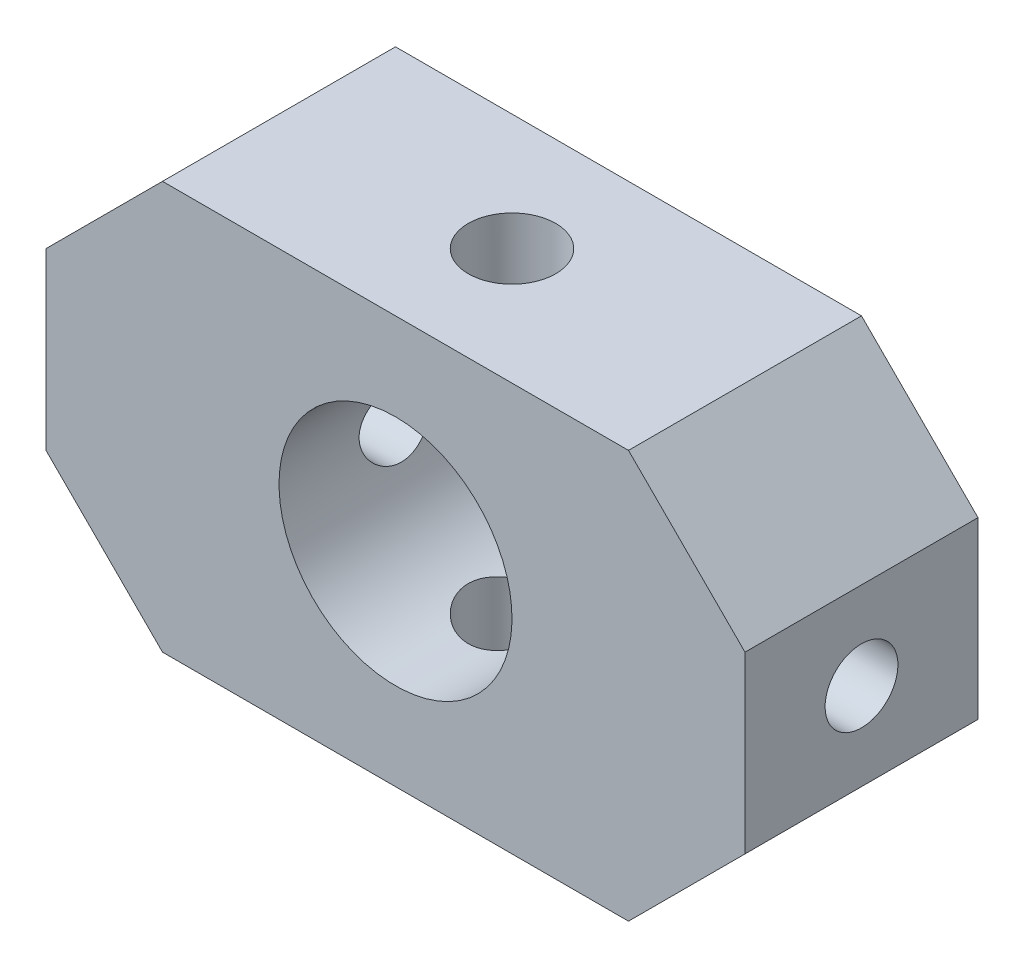
ISO-10303-21;
HEADER;
FILE_DESCRIPTION(('STEP AP214'),'2;1');
FILE_NAME('part.step','',(''),(''),'','','');
FILE_SCHEMA(('AUTOMOTIVE_DESIGN { 1 0 10303 214 1 1 1 1 }'));
ENDSEC;
DATA;
#1=APPLICATION_CONTEXT('core data for automotive mechanical design processes');
#2=APPLICATION_PROTOCOL_DEFINITION('international standard','automotive_design',2000,#1);
#3=PRODUCT_CONTEXT('',#1,'mechanical');
#4=PRODUCT('Part','Part','',(#3));
#5=PRODUCT_RELATED_PRODUCT_CATEGORY('part','',(#4));
#6=PRODUCT_DEFINITION_FORMATION('','',#4);
#7=PRODUCT_DEFINITION_CONTEXT('part definition',#1,'design');
#8=PRODUCT_DEFINITION('design','',#6,#7);
#9=PRODUCT_DEFINITION_SHAPE('','',#8);
#10=(LENGTH_UNIT() NAMED_UNIT(*) SI_UNIT(.MILLI.,.METRE.));
#11=(NAMED_UNIT(*) PLANE_ANGLE_UNIT() SI_UNIT($,.RADIAN.));
#12=(NAMED_UNIT(*) SI_UNIT($,.STERADIAN.) SOLID_ANGLE_UNIT());
#13=UNCERTAINTY_MEASURE_WITH_UNIT(LENGTH_MEASURE(1.E-05),#10,'distance_accuracy_value','');
#14=(GEOMETRIC_REPRESENTATION_CONTEXT(3) GLOBAL_UNCERTAINTY_ASSIGNED_CONTEXT((#13)) GLOBAL_UNIT_ASSIGNED_CONTEXT((#10,
#11,#12)) REPRESENTATION_CONTEXT('',''));
#15=CARTESIAN_POINT('',(0.,0.,0.));
#16=DIRECTION('',(0.,0.,1.));
#17=DIRECTION('',(1.,0.,0.));
#18=AXIS2_PLACEMENT_3D('',#15,#16,#17);
#19=CARTESIAN_POINT('',(-9.094947E-13,667.332012286217,-379.357743681072));
#20=DIRECTION('',(0.,-1.,0.));
#21=DIRECTION('',(0.,0.,-1.));
#22=AXIS2_PLACEMENT_3D('',#19,#20,#21);
#23=CYLINDRICAL_SURFACE('',#22,1.5);
#24=CARTESIAN_POINT('',(1.49999999999909,671.040111529767,-379.357743681072));
#25=CARTESIAN_POINT('',(1.49999511198471,671.040116190909,-379.276857999488));
#26=CARTESIAN_POINT('',(1.49342462043726,671.042792461082,-379.195895275863));
#27=CARTESIAN_POINT('',(1.46739553122237,671.053159451966,-379.036328094789));
#28=CARTESIAN_POINT('',(1.44791647247458,671.060858133288,-378.957727588738));
#29=CARTESIAN_POINT('',(1.39689210182157,671.080269101262,-378.805360572128));
#30=CARTESIAN_POINT('',(1.3653836631549,671.09196911147,-378.731580088393));
#31=CARTESIAN_POINT('',(1.29130569359724,671.118047885065,-378.590350076619));
#32=CARTESIAN_POINT('',(1.24873621383632,671.132426636069,-378.522900519316));
#33=CARTESIAN_POINT('',(1.15146764076575,671.163047736722,-378.392855107349));
#34=CARTESIAN_POINT('',(1.09630616188697,671.179345019224,-378.330617896596));
#35=CARTESIAN_POINT('',(0.976398614973348,671.21150910395,-378.216023018933));
#36=CARTESIAN_POINT('',(0.911650100404895,671.227375795063,-378.163667881628));
#37=CARTESIAN_POINT('',(0.771694621327232,671.257541035399,-378.0686041709));
#38=CARTESIAN_POINT('',(0.696206884644265,671.27176791097,-378.026284177692));
#39=CARTESIAN_POINT('',(0.538555706332426,671.296392373497,-377.955092479165));
#40=CARTESIAN_POINT('',(0.456394597047872,671.306791291355,-377.926216098854));
#41=CARTESIAN_POINT('',(0.291489314134773,671.322199260018,-377.883985779726));
#42=CARTESIAN_POINT('',(0.208923141283723,671.327421441928,-377.870016044248));
#43=CARTESIAN_POINT('',(0.0424643069468851,671.332652427287,-377.85602248002));
#44=CARTESIAN_POINT('',(-0.0414279133915015,671.332662929505,-377.855994107023));
#45=CARTESIAN_POINT('',(-0.203743429414592,671.327604948781,-377.869525431914));
#46=CARTESIAN_POINT('',(-0.282231952478354,671.322787719939,-377.882412937428));
#47=CARTESIAN_POINT('',(-0.435839001661055,671.308945061628,-377.920279528897));
#48=CARTESIAN_POINT('',(-0.510957279028412,671.299919322095,-377.945259505775));
#49=CARTESIAN_POINT('',(-0.656990622216135,671.278389740545,-378.006914793581));
#50=CARTESIAN_POINT('',(-0.727828484027123,671.265837130183,-378.043755231377));
#51=CARTESIAN_POINT('',(-0.862489409871084,671.238524743768,-378.127937917637));
#52=CARTESIAN_POINT('',(-0.926310509137586,671.223764352231,-378.175283096393));
#53=CARTESIAN_POINT('',(-1.04908093631065,671.192540001493,-378.282362393654));
#54=CARTESIAN_POINT('',(-1.10752840506853,671.176026894623,-378.342658375664));
#55=CARTESIAN_POINT('',(-1.21368958697655,671.143841658307,-378.472316677958));
#56=CARTESIAN_POINT('',(-1.26139735324417,671.128169998433,-378.541683987857));
#57=CARTESIAN_POINT('',(-1.34568993912095,671.099127485447,-378.689519176247));
#58=CARTESIAN_POINT('',(-1.38199556964195,671.085817415614,-378.768158838189));
#59=CARTESIAN_POINT('',(-1.44060169661454,671.063722810338,-378.930989609935));
#60=CARTESIAN_POINT('',(-1.46293219797052,671.054928586619,-379.015168394377));
#61=CARTESIAN_POINT('',(-1.48518920410886,671.046075584502,-379.143104736386));
#62=CARTESIAN_POINT('',(-1.49073488518302,671.04384815885,-379.185805581577));
#63=CARTESIAN_POINT('',(-1.49814158486117,671.040864889965,-379.271578222214));
#64=CARTESIAN_POINT('',(-1.50000260420035,671.040109046439,-379.314650017586));
#65=CARTESIAN_POINT('',(-1.49999511198653,671.040116190909,-379.438629362656));
#66=CARTESIAN_POINT('',(-1.49342462043908,671.042792461082,-379.519592086281));
#67=CARTESIAN_POINT('',(-1.46739553122419,671.053159451966,-379.679159267355));
#68=CARTESIAN_POINT('',(-1.44791647247639,671.060858133288,-379.757759773406));
#69=CARTESIAN_POINT('',(-1.3968921018234,671.080269101262,-379.910126790016));
#70=CARTESIAN_POINT('',(-1.36538366315674,671.09196911147,-379.983907273751));
#71=CARTESIAN_POINT('',(-1.29130569359908,671.118047885065,-380.125137285525));
#72=CARTESIAN_POINT('',(-1.24873621383815,671.132426636069,-380.192586842828));
#73=CARTESIAN_POINT('',(-1.15146764076757,671.163047736722,-380.322632254795));
#74=CARTESIAN_POINT('',(-1.09630616188879,671.179345019224,-380.384869465548));
#75=CARTESIAN_POINT('',(-0.97639861497517,671.21150910395,-380.499464343211));
#76=CARTESIAN_POINT('',(-0.911650100406716,671.227375795063,-380.551819480516));
#77=CARTESIAN_POINT('',(-0.771694621329053,671.257541035399,-380.646883191243));
#78=CARTESIAN_POINT('',(-0.696206884646087,671.27176791097,-380.689203184452));
#79=CARTESIAN_POINT('',(-0.538555706334249,671.296392373497,-380.760394882979));
#80=CARTESIAN_POINT('',(-0.456394597049695,671.306791291355,-380.78927126329));
#81=CARTESIAN_POINT('',(-0.291489314136593,671.322199260018,-380.831501582418));
#82=CARTESIAN_POINT('',(-0.208923141285541,671.327421441928,-380.845471317896));
#83=CARTESIAN_POINT('',(-0.0424643069486976,671.332652427287,-380.859464882124));
#84=CARTESIAN_POINT('',(0.0414279133896914,671.332662929505,-380.859493255121));
#85=CARTESIAN_POINT('',(0.203743429412783,671.327604948781,-380.84596193023));
#86=CARTESIAN_POINT('',(0.282231952476543,671.322787719939,-380.833074424716));
#87=CARTESIAN_POINT('',(0.435839001659239,671.308945061628,-380.795207833247));
#88=CARTESIAN_POINT('',(0.510957279026592,671.299919322095,-380.770227856369));
#89=CARTESIAN_POINT('',(0.6569906222143,671.278389740545,-380.708572568563));
#90=CARTESIAN_POINT('',(0.72782848402528,671.265837130183,-380.671732130767));
#91=CARTESIAN_POINT('',(0.862489409869245,671.238524743768,-380.587549444507));
#92=CARTESIAN_POINT('',(0.926310509135756,671.223764352231,-380.540204265751));
#93=CARTESIAN_POINT('',(1.04908093630883,671.192540001493,-380.43312496849));
#94=CARTESIAN_POINT('',(1.10752840506671,671.176026894623,-380.37282898648));
#95=CARTESIAN_POINT('',(1.21368958697473,671.143841658307,-380.243170684186));
#96=CARTESIAN_POINT('',(1.26139735324235,671.128169998433,-380.173803374287));
#97=CARTESIAN_POINT('',(1.34568993911913,671.099127485447,-380.025968185897));
#98=CARTESIAN_POINT('',(1.38199556964013,671.085817415614,-379.947328523955));
#99=CARTESIAN_POINT('',(1.44060169661272,671.063722810338,-379.784497752209));
#100=CARTESIAN_POINT('',(1.4629321979687,671.054928586619,-379.700318967767));
#101=CARTESIAN_POINT('',(1.48518920410704,671.046075584502,-379.572382625758));
#102=CARTESIAN_POINT('',(1.4907348851812,671.04384815885,-379.529681780567));
#103=CARTESIAN_POINT('',(1.49814158485935,671.040864889965,-379.44390913993));
#104=CARTESIAN_POINT('',(1.50000260419853,671.040109046439,-379.400837344558));
#105=CARTESIAN_POINT('',(1.49999999999909,671.040111529767,-379.357743681072));
#106=B_SPLINE_CURVE_WITH_KNOTS('',3,(#24,#25,#26,#27,#28,#29,#30,#31,#32,#33,#34,#35,#36,#37,
#38,#39,#40,#41,#42,#43,#44,#45,#46,#47,#48,#49,#50,#51,#52,#53,#54,#55,#56,#57,#58,#59,#60,#61,
#62,#63,#64,#65,#66,#67,#68,#69,#70,#71,#72,#73,#74,#75,#76,#77,#78,#79,#80,#81,#82,#83,#84,#85,
#86,#87,#88,#89,#90,#91,#92,#93,#94,#95,#96,#97,#98,#99,#100,#101,#102,#103,#104,#105),
.UNSPECIFIED.,.T.,.F.,(4,2,2,2,2,2,2,2,2,2,2,2,2,2,2,2,2,2,2,2,2,2,2,2,2,2,2,2,2,2,2,2,2,2,2,2,
2,2,2,2,4),(0.,0.24248827557271,0.485361836176238,0.72749682572558,0.969630696016833,
1.22274114851057,1.47591630441615,1.73770084383832,1.99939428001788,2.24980028562971,
2.50012467025747,2.73806440302081,2.97602166888033,3.21744659529716,3.45893895195249,
3.71452823140494,3.97025869176964,4.2318349086875,4.49284757156316,4.62203867222691,
4.75122974711301,4.99371802268572,5.23659158328925,5.47872657283858,5.72086044312984,
5.97397089562359,6.22714605152916,6.48893059095133,6.75062402713089,7.00103003274273,
7.25135441737049,7.48929415013382,7.72725141599334,7.96867634241011,8.21016869906551,
8.46575797851796,8.72148843888266,8.98306465580052,9.24407731867618,9.37326841933992,
9.50245949422603),.UNSPECIFIED.);
#107=CARTESIAN_POINT('',(1.49999999999909,671.040111529767,-379.357743681072));
#108=VERTEX_POINT('',#107);
#109=EDGE_CURVE('E145',#108,#108,#106,.T.);
#110=ORIENTED_EDGE('',*,*,#109,.T.);
#111=EDGE_LOOP('',(#110));
#112=FACE_BOUND('',#111,.T.);
#113=CARTESIAN_POINT('',(-9.094947E-13,674.332012286217,-379.357743681072));
#114=DIRECTION('',(0.,-1.,0.));
#115=DIRECTION('',(0.,0.,-1.));
#116=AXIS2_PLACEMENT_3D('',#113,#114,#115);
#117=CIRCLE('',#116,1.5);
#118=CARTESIAN_POINT('',(-9.094947E-13,674.332012286217,-380.857743681072));
#119=VERTEX_POINT('',#118);
#120=EDGE_CURVE('E151',#119,#119,#117,.F.);
#121=ORIENTED_EDGE('',*,*,#120,.T.);
#122=EDGE_LOOP('',(#121));
#123=FACE_BOUND('',#122,.T.);
#124=ADVANCED_FACE('F17',(#112,#123),#23,.F.);
#125=CARTESIAN_POINT('',(7.61974364962953,667.332012286217,-379.357743681072));
#126=DIRECTION('',(1.,0.,0.));
#127=DIRECTION('',(0.,1.,0.));
#128=AXIS2_PLACEMENT_3D('',#125,#126,#127);
#129=CYLINDRICAL_SURFACE('',#128,1.25);
#130=CARTESIAN_POINT('',(-4.00000000000091,667.332012286218,-378.107743681072));
#131=CARTESIAN_POINT('',(-3.9999979748265,667.263613918298,-378.107746590627));
#132=CARTESIAN_POINT('',(-3.99822771187706,667.195180098471,-378.113379740461));
#133=CARTESIAN_POINT('',(-3.99133282611965,667.060283057105,-378.135718037327));
#134=CARTESIAN_POINT('',(-3.98620519309232,666.993821659993,-378.152433120595));
#135=CARTESIAN_POINT('',(-3.97315753613066,666.864880025921,-378.196314909849));
#136=CARTESIAN_POINT('',(-3.96524256173569,666.802392829391,-378.223462723994));
#137=CARTESIAN_POINT('',(-3.94743820369412,666.682868363655,-378.287366638495));
#138=CARTESIAN_POINT('',(-3.93754881174486,666.625831117368,-378.324122779255));
#139=CARTESIAN_POINT('',(-3.91650317548957,666.517052485715,-378.407395409992));
#140=CARTESIAN_POINT('',(-3.90531934909937,666.465502482796,-378.454154901091));
#141=CARTESIAN_POINT('',(-3.8831026506444,666.370823329259,-378.555601754828));
#142=CARTESIAN_POINT('',(-3.87206983792989,666.327697405779,-378.61029214175));
#143=CARTESIAN_POINT('',(-3.85110630378334,666.250050223573,-378.72771506996));
#144=CARTESIAN_POINT('',(-3.84121020791978,666.215772191656,-378.790615053154));
#145=CARTESIAN_POINT('',(-3.82407115634753,666.158391777192,-378.92160841426));
#146=CARTESIAN_POINT('',(-3.81682496865236,666.135275769668,-378.989695342504));
#147=CARTESIAN_POINT('',(-3.80755627117157,666.106178919112,-379.10804053866));
#148=CARTESIAN_POINT('',(-3.80461788799766,666.097134507495,-379.157494924006));
#149=CARTESIAN_POINT('',(-3.80067444434327,666.085050314896,-379.257207705864));
#150=CARTESIAN_POINT('',(-3.79966924138223,666.082010091388,-379.307466042847));
#151=CARTESIAN_POINT('',(-3.79967347978862,666.082015268084,-379.426050233852));
#152=CARTESIAN_POINT('',(-3.80153460046542,666.087633821041,-379.494392412074));
#153=CARTESIAN_POINT('',(-3.80875232250168,666.109908856301,-379.629098719024));
#154=CARTESIAN_POINT('',(-3.81411217384587,666.126575601538,-379.695460948576));
#155=CARTESIAN_POINT('',(-3.82766004161672,666.170316227394,-379.82419218838));
#156=CARTESIAN_POINT('',(-3.83584232747325,666.197369033007,-379.886568988668));
#157=CARTESIAN_POINT('',(-3.85410554380405,666.261048653118,-380.005905316139));
#158=CARTESIAN_POINT('',(-3.86418652418366,666.297675719276,-380.062864700869));
#159=CARTESIAN_POINT('',(-3.88550022799453,666.380811970053,-380.171717020376));
#160=CARTESIAN_POINT('',(-3.89675903366385,666.427593257539,-380.223397075971));
#161=CARTESIAN_POINT('',(-3.91894030445257,666.529139935698,-380.318331274369));
#162=CARTESIAN_POINT('',(-3.92986265556981,666.58390799729,-380.361582587104));
#163=CARTESIAN_POINT('',(-3.95044050516037,666.701412913982,-380.439373253785));
#164=CARTESIAN_POINT('',(-3.96006108305101,666.764304094577,-380.473689322203));
#165=CARTESIAN_POINT('',(-3.97663209466418,666.895279613533,-380.531142613161));
#166=CARTESIAN_POINT('',(-3.9835856788351,666.963357710017,-380.554293033764));
#167=CARTESIAN_POINT('',(-3.99246724869169,667.081791129674,-380.583476148687));
#168=CARTESIAN_POINT('',(-3.99527657467944,667.131350162141,-380.592558670302));
#169=CARTESIAN_POINT('',(-3.99904363975732,667.231270513149,-380.604693324284));
#170=CARTESIAN_POINT('',(-4.00000149169302,667.281631782606,-380.607745824176));
#171=CARTESIAN_POINT('',(-3.99999797482651,667.400410654139,-380.607740771517));
#172=CARTESIAN_POINT('',(-3.99822771187709,667.468844473966,-380.602107621682));
#173=CARTESIAN_POINT('',(-3.99133282611971,667.603741515332,-380.579769324816));
#174=CARTESIAN_POINT('',(-3.98620519309241,667.670202912444,-380.563054241549));
#175=CARTESIAN_POINT('',(-3.9731575361308,667.799144546516,-380.519172452293));
#176=CARTESIAN_POINT('',(-3.96524256173585,667.861631743046,-380.492024638148));
#177=CARTESIAN_POINT('',(-3.94743820369435,667.981156208781,-380.428120723648));
#178=CARTESIAN_POINT('',(-3.93754881174512,668.038193455068,-380.391364582887));
#179=CARTESIAN_POINT('',(-3.91650317548991,668.146972086721,-380.308091952151));
#180=CARTESIAN_POINT('',(-3.90531934909976,668.19852208964,-380.261332461052));
#181=CARTESIAN_POINT('',(-3.88310265064489,668.293201243177,-380.159885607313));
#182=CARTESIAN_POINT('',(-3.87206983793042,668.336327166657,-380.105195220392));
#183=CARTESIAN_POINT('',(-3.85110630378399,668.413974348862,-379.987772292182));
#184=CARTESIAN_POINT('',(-3.8412102079205,668.44825238078,-379.924872308987));
#185=CARTESIAN_POINT('',(-3.82407115634838,668.505632795243,-379.793878947881));
#186=CARTESIAN_POINT('',(-3.81682496865328,668.528748802767,-379.725792019637));
#187=CARTESIAN_POINT('',(-3.80755627117264,668.557845653323,-379.607446823482));
#188=CARTESIAN_POINT('',(-3.80461788799879,668.566890064939,-379.557992438136));
#189=CARTESIAN_POINT('',(-3.80067444434449,668.578974257539,-379.458279656279));
#190=CARTESIAN_POINT('',(-3.79966924138347,668.582014481047,-379.408021319297));
#191=CARTESIAN_POINT('',(-3.79967347978985,668.58200930435,-379.289437128292));
#192=CARTESIAN_POINT('',(-3.80153460046665,668.576390751393,-379.22109495007));
#193=CARTESIAN_POINT('',(-3.80875232250289,668.554115716133,-379.08638864312));
#194=CARTESIAN_POINT('',(-3.81411217384707,668.537448970896,-379.020026413568));
#195=CARTESIAN_POINT('',(-3.82766004161788,668.49370834504,-378.891295173764));
#196=CARTESIAN_POINT('',(-3.83584232747438,668.466655539427,-378.828918373475));
#197=CARTESIAN_POINT('',(-3.85410554380511,668.402975919316,-378.709582046005));
#198=CARTESIAN_POINT('',(-3.86418652418469,668.366348853158,-378.652622661275));
#199=CARTESIAN_POINT('',(-3.88550022799548,668.283212602381,-378.543770341768));
#200=CARTESIAN_POINT('',(-3.89675903366474,668.236431314896,-378.492090286173));
#201=CARTESIAN_POINT('',(-3.91894030445336,668.134884636736,-378.397156087774));
#202=CARTESIAN_POINT('',(-3.92986265557055,668.080116575145,-378.35390477504));
#203=CARTESIAN_POINT('',(-3.950440505161,667.962611658452,-378.276114108359));
#204=CARTESIAN_POINT('',(-3.96006108305158,667.899720477857,-378.241798039941));
#205=CARTESIAN_POINT('',(-3.97663209466461,667.768744958901,-378.184344748983));
#206=CARTESIAN_POINT('',(-3.98358567883547,667.700666862417,-378.16119432838));
#207=CARTESIAN_POINT('',(-3.9924672486919,667.58223344276,-378.132011213457));
#208=CARTESIAN_POINT('',(-3.99527657467958,667.532674410294,-378.122928691842));
#209=CARTESIAN_POINT('',(-3.99904363975736,667.432754059287,-378.11079403786));
#210=CARTESIAN_POINT('',(-4.00000149169303,667.382392789831,-378.107741537968));
#211=CARTESIAN_POINT('',(-4.00000000000091,667.332012286218,-378.107743681072));
#212=B_SPLINE_CURVE_WITH_KNOTS('',3,(#130,#131,#132,#133,#134,#135,#136,#137,#138,#139,#140,
#141,#142,#143,#144,#145,#146,#147,#148,#149,#150,#151,#152,#153,#154,#155,#156,#157,#158,#159,
#160,#161,#162,#163,#164,#165,#166,#167,#168,#169,#170,#171,#172,#173,#174,#175,#176,#177,#178,
#179,#180,#181,#182,#183,#184,#185,#186,#187,#188,#189,#190,#191,#192,#193,#194,#195,#196,#197,
#198,#199,#200,#201,#202,#203,#204,#205,#206,#207,#208,#209,#210,#211),.UNSPECIFIED.,.T.,.F.,(4,
2,2,2,2,2,2,2,2,2,2,2,2,2,2,2,2,2,2,2,2,2,2,2,2,2,2,2,2,2,2,2,2,2,2,2,2,2,2,2,4),(0.,
0.20500663316506,0.410197327523862,0.615018195217445,0.819839924225944,1.03035755615529,
1.24095567673723,1.45684137371024,1.67246287840654,1.8231677375757,1.97386148896801,
2.17859208186309,2.38351312095856,2.58802052110897,2.79253329728788,3.00341166738081,
3.21436072131924,3.43016220536972,3.64570797794709,3.79671987044711,3.94772255862604,
4.15272919179114,4.35791988614983,4.56274075384335,4.76756248285183,4.97808011478117,
5.18867823536314,5.40456393233625,5.62018543703246,5.77089029620009,5.92158404759095,
6.12631464048609,6.33123567958167,6.53574307973201,6.74025585591106,6.95113422600388,
7.16208327994233,7.37788476399275,7.59343053657023,7.74444242906854,7.89544511724605),.UNSPECIFIED.);
#213=CARTESIAN_POINT('',(-4.00000000000091,667.332012286218,-378.107743681072));
#214=VERTEX_POINT('',#213);
#215=EDGE_CURVE('E139',#214,#214,#212,.T.);
#216=ORIENTED_EDGE('',*,*,#215,.T.);
#217=EDGE_LOOP('',(#216));
#218=FACE_BOUND('',#217,.T.);
#219=CARTESIAN_POINT('',(-12.0000000000009,667.332012286217,-379.357743681072));
#220=DIRECTION('',(1.,0.,0.));
#221=DIRECTION('',(0.,1.,0.));
#222=AXIS2_PLACEMENT_3D('',#219,#220,#221);
#223=CIRCLE('',#222,1.25);
#224=CARTESIAN_POINT('',(-12.0000000000009,668.582012286217,-379.357743681072));
#225=VERTEX_POINT('',#224);
#226=EDGE_CURVE('E21',#225,#225,#223,.F.);
#227=ORIENTED_EDGE('',*,*,#226,.T.);
#228=EDGE_LOOP('',(#227));
#229=FACE_BOUND('',#228,.T.);
#230=ADVANCED_FACE('F247',(#218,#229),#129,.F.);
#231=CARTESIAN_POINT('',(-12.0000000000009,674.332012286217,-383.357743681072));
#232=DIRECTION('',(0.,0.,1.));
#233=DIRECTION('',(1.,0.,0.));
#234=AXIS2_PLACEMENT_3D('',#231,#232,#233);
#235=PLANE('',#234);
#236=CARTESIAN_POINT('',(-9.094947E-13,667.332012286219,-383.357743681072));
#237=DIRECTION('',(0.,0.,-1.));
#238=DIRECTION('',(0.,1.,0.));
#239=AXIS2_PLACEMENT_3D('',#236,#237,#238);
#240=CIRCLE('',#239,4.);
#241=CARTESIAN_POINT('',(-9.094947E-13,671.332012286219,-383.357743681072));
#242=VERTEX_POINT('',#241);
#243=EDGE_CURVE('E273',#242,#242,#240,.F.);
#244=ORIENTED_EDGE('',*,*,#243,.T.);
#245=EDGE_LOOP('',(#244));
#246=FACE_BOUND('',#245,.T.);
#247=DIRECTION('',(1.,0.,0.));
#248=VECTOR('',#247,1.);
#249=CARTESIAN_POINT('',(-8.00000000000091,674.332012286217,-383.357743681072));
#250=LINE('',#249,#248);
#251=CARTESIAN_POINT('',(-8.00000000000091,674.332012286217,-383.357743681072));
#252=VERTEX_POINT('',#251);
#253=CARTESIAN_POINT('',(7.99999999999909,674.332012286217,-383.357743681072));
#254=VERTEX_POINT('',#253);
#255=EDGE_CURVE('E197',#252,#254,#250,.T.);
#256=ORIENTED_EDGE('',*,*,#255,.T.);
#257=DIRECTION('',(-0.707106781186547,0.707106781186548,0.));
#258=VECTOR('',#257,1.);
#259=CARTESIAN_POINT('',(9.99999999999909,672.332012286217,-383.357743681072));
#260=LINE('',#259,#258);
#261=CARTESIAN_POINT('',(11.9999999999991,670.332012286217,-383.357743681072));
#262=VERTEX_POINT('',#261);
#263=EDGE_CURVE('E156',#262,#254,#260,.T.);
#264=ORIENTED_EDGE('',*,*,#263,.F.);
#265=DIRECTION('',(0.,-1.,0.));
#266=VECTOR('',#265,1.);
#267=CARTESIAN_POINT('',(11.9999999999991,664.332012286217,-383.357743681072));
#268=LINE('',#267,#266);
#269=CARTESIAN_POINT('',(11.9999999999991,664.332012286217,-383.357743681072));
#270=VERTEX_POINT('',#269);
#271=EDGE_CURVE('E204',#262,#270,#268,.T.);
#272=ORIENTED_EDGE('',*,*,#271,.T.);
#273=DIRECTION('',(0.707106781186548,0.707106781186547,0.));
#274=VECTOR('',#273,1.);
#275=CARTESIAN_POINT('',(9.99999999999909,662.332012286217,-383.357743681072));
#276=LINE('',#275,#274);
#277=CARTESIAN_POINT('',(7.99999999999909,660.332012286217,-383.357743681072));
#278=VERTEX_POINT('',#277);
#279=EDGE_CURVE('E165',#278,#270,#276,.T.);
#280=ORIENTED_EDGE('',*,*,#279,.F.);
#281=DIRECTION('',(1.,0.,0.));
#282=VECTOR('',#281,1.);
#283=CARTESIAN_POINT('',(-8.00000000000091,660.332012286217,-383.357743681072));
#284=LINE('',#283,#282);
#285=CARTESIAN_POINT('',(-8.00000000000091,660.332012286217,-383.357743681072));
#286=VERTEX_POINT('',#285);
#287=EDGE_CURVE('E167',#278,#286,#284,.F.);
#288=ORIENTED_EDGE('',*,*,#287,.T.);
#289=DIRECTION('',(0.707106781186547,-0.707106781186548,0.));
#290=VECTOR('',#289,1.);
#291=CARTESIAN_POINT('',(-10.0000000000009,662.332012286217,-383.357743681072));
#292=LINE('',#291,#290);
#293=CARTESIAN_POINT('',(-12.0000000000009,664.332012286217,-383.357743681072));
#294=VERTEX_POINT('',#293);
#295=EDGE_CURVE('E81',#294,#286,#292,.T.);
#296=ORIENTED_EDGE('',*,*,#295,.F.);
#297=DIRECTION('',(0.,1.,0.));
#298=VECTOR('',#297,1.);
#299=CARTESIAN_POINT('',(-12.0000000000009,664.332012286217,-383.357743681072));
#300=LINE('',#299,#298);
#301=CARTESIAN_POINT('',(-12.0000000000009,670.332012286217,-383.357743681072));
#302=VERTEX_POINT('',#301);
#303=EDGE_CURVE('E83',#294,#302,#300,.T.);
#304=ORIENTED_EDGE('',*,*,#303,.T.);
#305=DIRECTION('',(-0.707106781186548,-0.707106781186547,0.));
#306=VECTOR('',#305,1.);
#307=CARTESIAN_POINT('',(-10.0000000000009,672.332012286217,-383.357743681072));
#308=LINE('',#307,#306);
#309=EDGE_CURVE('E86',#252,#302,#308,.T.);
#310=ORIENTED_EDGE('',*,*,#309,.F.);
#311=EDGE_LOOP('',(#256,#264,#272,#280,#288,#296,#304,#310));
#312=FACE_BOUND('',#311,.T.);
#313=ADVANCED_FACE('F85',(#246,#312),#235,.F.);
#314=CARTESIAN_POINT('',(7.61974364962953,667.332012286217,-379.357743681072));
#315=DIRECTION('',(1.,0.,0.));
#316=DIRECTION('',(0.,1.,0.));
#317=AXIS2_PLACEMENT_3D('',#314,#315,#316);
#318=CYLINDRICAL_SURFACE('',#317,1.25);
#319=CARTESIAN_POINT('',(3.99999999999909,667.332012286219,-380.607743681072));
#320=CARTESIAN_POINT('',(3.9999979748247,667.263613918299,-380.607740771517));
#321=CARTESIAN_POINT('',(3.99822771187528,667.195180098472,-380.602107621683));
#322=CARTESIAN_POINT('',(3.99133282611789,667.060283057105,-380.579769324817));
#323=CARTESIAN_POINT('',(3.98620519309058,666.993821659994,-380.56305424155));
#324=CARTESIAN_POINT('',(3.97315753612894,666.864880025922,-380.519172452295));
#325=CARTESIAN_POINT('',(3.96524256173397,666.802392829392,-380.49202463815));
#326=CARTESIAN_POINT('',(3.94743820369241,666.682868363656,-380.428120723649));
#327=CARTESIAN_POINT('',(3.93754881174316,666.625831117369,-380.391364582889));
#328=CARTESIAN_POINT('',(3.91650317548788,666.517052485716,-380.308091952153));
#329=CARTESIAN_POINT('',(3.9053193490977,666.465502482796,-380.261332461054));
#330=CARTESIAN_POINT('',(3.88310265064273,666.370823329259,-380.159885607316));
#331=CARTESIAN_POINT('',(3.87206983792822,666.32769740578,-380.105195220395));
#332=CARTESIAN_POINT('',(3.85110630378166,666.250050223574,-379.987772292185));
#333=CARTESIAN_POINT('',(3.84121020791809,666.215772191656,-379.924872308991));
#334=CARTESIAN_POINT('',(3.82407115634581,666.158391777192,-379.793878947885));
#335=CARTESIAN_POINT('',(3.81682496865063,666.135275769669,-379.725792019641));
#336=CARTESIAN_POINT('',(3.8075562711698,666.106178919112,-379.607446823485));
#337=CARTESIAN_POINT('',(3.80461788799587,666.097134507495,-379.557992438139));
#338=CARTESIAN_POINT('',(3.80067444434145,666.085050314896,-379.45827965628));
#339=CARTESIAN_POINT('',(3.79966924138041,666.082010091388,-379.408021319297));
#340=CARTESIAN_POINT('',(3.7996734797868,666.082015268084,-379.289437128292));
#341=CARTESIAN_POINT('',(3.8015346004636,666.087633821041,-379.22109495007));
#342=CARTESIAN_POINT('',(3.80875232249986,666.109908856301,-379.08638864312));
#343=CARTESIAN_POINT('',(3.81411217384405,666.126575601538,-379.020026413568));
#344=CARTESIAN_POINT('',(3.82766004161491,666.170316227394,-378.891295173764));
#345=CARTESIAN_POINT('',(3.83584232747143,666.197369033007,-378.828918373475));
#346=CARTESIAN_POINT('',(3.85410554380223,666.261048653118,-378.709582046005));
#347=CARTESIAN_POINT('',(3.86418652418184,666.297675719276,-378.652622661275));
#348=CARTESIAN_POINT('',(3.8855002279927,666.380811970053,-378.543770341768));
#349=CARTESIAN_POINT('',(3.89675903366202,666.427593257538,-378.492090286173));
#350=CARTESIAN_POINT('',(3.91894030445074,666.529139935698,-378.397156087775));
#351=CARTESIAN_POINT('',(3.92986265556799,666.583907997289,-378.35390477504));
#352=CARTESIAN_POINT('',(3.95044050515855,666.701412913982,-378.276114108359));
#353=CARTESIAN_POINT('',(3.96006108304918,666.764304094577,-378.241798039941));
#354=CARTESIAN_POINT('',(3.97663209466235,666.895279613533,-378.184344748983));
#355=CARTESIAN_POINT('',(3.98358567883328,666.963357710017,-378.16119432838));
#356=CARTESIAN_POINT('',(3.99246724868985,667.081791129674,-378.132011213457));
#357=CARTESIAN_POINT('',(3.9952765746776,667.131350162141,-378.122928691842));
#358=CARTESIAN_POINT('',(3.99904363975548,667.231270513148,-378.11079403786));
#359=CARTESIAN_POINT('',(4.00000149169119,667.281631782605,-378.107741537968));
#360=CARTESIAN_POINT('',(3.99999797482471,667.400410654138,-378.107746590627));
#361=CARTESIAN_POINT('',(3.99822771187531,667.468844473965,-378.113379740461));
#362=CARTESIAN_POINT('',(3.99133282611796,667.603741515331,-378.135718037328));
#363=CARTESIAN_POINT('',(3.98620519309067,667.670202912443,-378.152433120595));
#364=CARTESIAN_POINT('',(3.97315753612908,667.799144546515,-378.19631490985));
#365=CARTESIAN_POINT('',(3.96524256173414,667.861631743045,-378.223462723995));
#366=CARTESIAN_POINT('',(3.94743820369265,667.981156208781,-378.287366638496));
#367=CARTESIAN_POINT('',(3.93754881174342,668.038193455068,-378.324122779256));
#368=CARTESIAN_POINT('',(3.91650317548822,668.146972086721,-378.407395409993));
#369=CARTESIAN_POINT('',(3.90531934909807,668.19852208964,-378.454154901092));
#370=CARTESIAN_POINT('',(3.8831026506432,668.293201243177,-378.55560175483));
#371=CARTESIAN_POINT('',(3.87206983792875,668.336327166656,-378.610292141751));
#372=CARTESIAN_POINT('',(3.85110630378231,668.413974348862,-378.727715069961));
#373=CARTESIAN_POINT('',(3.84121020791881,668.448252380779,-378.790615053156));
#374=CARTESIAN_POINT('',(3.82407115634667,668.505632795243,-378.921608414262));
#375=CARTESIAN_POINT('',(3.81682496865155,668.528748802767,-378.989695342506));
#376=CARTESIAN_POINT('',(3.80755627117087,668.557845653323,-379.108040538661));
#377=CARTESIAN_POINT('',(3.804617887997,668.566890064939,-379.157494924007));
#378=CARTESIAN_POINT('',(3.80067444434267,668.578974257539,-379.257207705865));
#379=CARTESIAN_POINT('',(3.79966924138165,668.582014481047,-379.307466042847));
#380=CARTESIAN_POINT('',(3.79967347978804,668.58200930435,-379.426050233852));
#381=CARTESIAN_POINT('',(3.80153460046483,668.576390751393,-379.494392412074));
#382=CARTESIAN_POINT('',(3.80875232250107,668.554115716133,-379.629098719024));
#383=CARTESIAN_POINT('',(3.81411217384525,668.537448970896,-379.695460948576));
#384=CARTESIAN_POINT('',(3.82766004161606,668.49370834504,-379.82419218838));
#385=CARTESIAN_POINT('',(3.83584232747256,668.466655539427,-379.886568988669));
#386=CARTESIAN_POINT('',(3.8541055438033,668.402975919316,-380.005905316139));
#387=CARTESIAN_POINT('',(3.86418652418288,668.366348853158,-380.062864700869));
#388=CARTESIAN_POINT('',(3.88550022799366,668.283212602381,-380.171717020376));
#389=CARTESIAN_POINT('',(3.89675903366293,668.236431314896,-380.223397075971));
#390=CARTESIAN_POINT('',(3.91894030445155,668.134884636736,-380.31833127437));
#391=CARTESIAN_POINT('',(3.92986265556874,668.080116575145,-380.361582587104));
#392=CARTESIAN_POINT('',(3.95044050515918,667.962611658452,-380.439373253785));
#393=CARTESIAN_POINT('',(3.96006108304976,667.899720477857,-380.473689322203));
#394=CARTESIAN_POINT('',(3.97663209466279,667.768744958901,-380.531142613161));
#395=CARTESIAN_POINT('',(3.98358567883365,667.700666862417,-380.554293033764));
#396=CARTESIAN_POINT('',(3.99246724869007,667.58223344276,-380.583476148687));
#397=CARTESIAN_POINT('',(3.99527657467774,667.532674410294,-380.592558670302));
#398=CARTESIAN_POINT('',(3.99904363975552,667.432754059288,-380.604693324284));
#399=CARTESIAN_POINT('',(4.0000014916912,667.382392789832,-380.607745824176));
#400=CARTESIAN_POINT('',(3.99999999999909,667.332012286219,-380.607743681072));
#401=B_SPLINE_CURVE_WITH_KNOTS('',3,(#319,#320,#321,#322,#323,#324,#325,#326,#327,#328,#329,
#330,#331,#332,#333,#334,#335,#336,#337,#338,#339,#340,#341,#342,#343,#344,#345,#346,#347,#348,
#349,#350,#351,#352,#353,#354,#355,#356,#357,#358,#359,#360,#361,#362,#363,#364,#365,#366,#367,
#368,#369,#370,#371,#372,#373,#374,#375,#376,#377,#378,#379,#380,#381,#382,#383,#384,#385,#386,
#387,#388,#389,#390,#391,#392,#393,#394,#395,#396,#397,#398,#399,#400),.UNSPECIFIED.,.T.,.F.,(4,
2,2,2,2,2,2,2,2,2,2,2,2,2,2,2,2,2,2,2,2,2,2,2,2,2,2,2,2,2,2,2,2,2,2,2,2,2,2,2,4),(0.,
0.205006633165262,0.410197327523926,0.615018195217689,0.819839924226094,1.03035755615544,
1.24095567673722,1.45684137371038,1.67246287840658,1.82316773757622,1.97386148896898,
2.178592081864,2.38351312095953,2.58802052110998,2.79253329728885,3.00341166738166,
3.21436072132013,3.43016220537061,3.6457079779481,3.79671987044744,3.94772255862593,
4.15272919179112,4.35791988614989,4.56274075384347,4.76756248285201,4.97808011478147,
5.18867823536316,5.40456393233623,5.62018543703251,5.77089029620073,5.92158404759204,
6.12631464048712,6.3312356795827,6.53574307973309,6.7402558559121,6.95113422600496,
7.16208327994337,7.37788476399379,7.59343053657127,7.74444242906903,7.89544511724609),.UNSPECIFIED.);
#402=CARTESIAN_POINT('',(3.99999999999909,667.332012286219,-380.607743681072));
#403=VERTEX_POINT('',#402);
#404=EDGE_CURVE('E118',#403,#403,#401,.T.);
#405=ORIENTED_EDGE('',*,*,#404,.T.);
#406=EDGE_LOOP('',(#405));
#407=FACE_BOUND('',#406,.T.);
#408=CARTESIAN_POINT('',(11.9999999999991,667.332012286217,-379.357743681072));
#409=DIRECTION('',(1.,0.,0.));
#410=DIRECTION('',(0.,1.,0.));
#411=AXIS2_PLACEMENT_3D('',#408,#409,#410);
#412=CIRCLE('',#411,1.25);
#413=CARTESIAN_POINT('',(11.9999999999991,668.582012286217,-379.357743681072));
#414=VERTEX_POINT('',#413);
#415=EDGE_CURVE('E154',#414,#414,#412,.T.);
#416=ORIENTED_EDGE('',*,*,#415,.T.);
#417=EDGE_LOOP('',(#416));
#418=FACE_BOUND('',#417,.T.);
#419=ADVANCED_FACE('F256',(#407,#418),#318,.F.);
#420=CARTESIAN_POINT('',(-9.094947E-13,667.332012286217,-379.357743681072));
#421=DIRECTION('',(0.,-1.,0.));
#422=DIRECTION('',(0.,0.,-1.));
#423=AXIS2_PLACEMENT_3D('',#420,#421,#422);
#424=CYLINDRICAL_SURFACE('',#423,1.5);
#425=CARTESIAN_POINT('',(1.49999999999907,663.623913042671,-379.357743681072));
#426=CARTESIAN_POINT('',(1.49999511198468,663.623908381529,-379.438629362656));
#427=CARTESIAN_POINT('',(1.49342462043725,663.621232111356,-379.519592086281));
#428=CARTESIAN_POINT('',(1.46739553122238,663.610865120472,-379.679159267355));
#429=CARTESIAN_POINT('',(1.44791647247458,663.60316643915,-379.757759773406));
#430=CARTESIAN_POINT('',(1.39689210182157,663.583755471176,-379.910126790016));
#431=CARTESIAN_POINT('',(1.3653836631549,663.572055460968,-379.983907273751));
#432=CARTESIAN_POINT('',(1.29130569359724,663.545976687372,-380.125137285525));
#433=CARTESIAN_POINT('',(1.24873621383632,663.531597936369,-380.192586842828));
#434=CARTESIAN_POINT('',(1.15146764076575,663.500976835716,-380.322632254795));
#435=CARTESIAN_POINT('',(1.09630616188697,663.484679553214,-380.384869465548));
#436=CARTESIAN_POINT('',(0.976398614973348,663.452515468488,-380.499464343211));
#437=CARTESIAN_POINT('',(0.911650100404894,663.436648777375,-380.551819480516));
#438=CARTESIAN_POINT('',(0.771694621327238,663.406483537039,-380.646883191243));
#439=CARTESIAN_POINT('',(0.69620688464428,663.392256661468,-380.689203184452));
#440=CARTESIAN_POINT('',(0.538555706332442,663.367632198941,-380.760394882979));
#441=CARTESIAN_POINT('',(0.45639459704788,663.357233281083,-380.78927126329));
#442=CARTESIAN_POINT('',(0.291489314134774,663.34182531242,-380.831501582418));
#443=CARTESIAN_POINT('',(0.208923141283725,663.33660313051,-380.845471317896));
#444=CARTESIAN_POINT('',(0.0424643069468872,663.331372145151,-380.859464882124));
#445=CARTESIAN_POINT('',(-0.0414279133915008,663.331361642933,-380.859493255121));
#446=CARTESIAN_POINT('',(-0.203743429414584,663.336419623657,-380.84596193023));
#447=CARTESIAN_POINT('',(-0.282231952478338,663.341236852499,-380.833074424716));
#448=CARTESIAN_POINT('',(-0.435839001661042,663.35507951081,-380.795207833247));
#449=CARTESIAN_POINT('',(-0.510957279028409,663.364105250343,-380.770227856369));
#450=CARTESIAN_POINT('',(-0.656990622216117,663.385634831893,-380.708572568563));
#451=CARTESIAN_POINT('',(-0.727828484027081,663.398187442255,-380.671732130767));
#452=CARTESIAN_POINT('',(-0.862489409871041,663.42549982867,-380.587549444507));
#453=CARTESIAN_POINT('',(-0.926310509137562,663.440260220207,-380.540204265751));
#454=CARTESIAN_POINT('',(-1.04908093631065,663.471484570945,-380.43312496849));
#455=CARTESIAN_POINT('',(-1.10752840506854,663.487997677815,-380.37282898648));
#456=CARTESIAN_POINT('',(-1.21368958697654,663.520182914131,-380.243170684186));
#457=CARTESIAN_POINT('',(-1.26139735324415,663.535854574005,-380.173803374287));
#458=CARTESIAN_POINT('',(-1.34568993912093,663.564897086991,-380.025968185897));
#459=CARTESIAN_POINT('',(-1.38199556964194,663.578207156824,-379.947328523955));
#460=CARTESIAN_POINT('',(-1.44060169661454,663.6003017621,-379.784497752209));
#461=CARTESIAN_POINT('',(-1.46293219797052,663.609095985819,-379.700318967767));
#462=CARTESIAN_POINT('',(-1.48518920410885,663.617948987936,-379.572382625758));
#463=CARTESIAN_POINT('',(-1.49073488518302,663.620176413588,-379.529681780567));
#464=CARTESIAN_POINT('',(-1.49814158486117,663.623159682473,-379.44390913993));
#465=CARTESIAN_POINT('',(-1.50000260420035,663.623915525999,-379.400837344558));
#466=CARTESIAN_POINT('',(-1.49999511198653,663.623908381529,-379.276857999488));
#467=CARTESIAN_POINT('',(-1.49342462043908,663.621232111356,-379.195895275863));
#468=CARTESIAN_POINT('',(-1.46739553122419,663.610865120472,-379.036328094789));
#469=CARTESIAN_POINT('',(-1.44791647247639,663.60316643915,-378.957727588738));
#470=CARTESIAN_POINT('',(-1.3968921018234,663.583755471176,-378.805360572128));
#471=CARTESIAN_POINT('',(-1.36538366315674,663.572055460968,-378.731580088393));
#472=CARTESIAN_POINT('',(-1.29130569359908,663.545976687372,-378.590350076619));
#473=CARTESIAN_POINT('',(-1.24873621383815,663.531597936369,-378.522900519316));
#474=CARTESIAN_POINT('',(-1.15146764076759,663.500976835716,-378.392855107349));
#475=CARTESIAN_POINT('',(-1.09630616188883,663.484679553214,-378.330617896596));
#476=CARTESIAN_POINT('',(-0.976398614975223,663.452515468488,-378.216023018933));
#477=CARTESIAN_POINT('',(-0.911650100406742,663.436648777375,-378.163667881628));
#478=CARTESIAN_POINT('',(-0.771694621329051,663.406483537039,-378.0686041709));
#479=CARTESIAN_POINT('',(-0.696206884646087,663.392256661468,-378.026284177692));
#480=CARTESIAN_POINT('',(-0.538555706334249,663.367632198941,-377.955092479165));
#481=CARTESIAN_POINT('',(-0.456394597049696,663.357233281083,-377.926216098854));
#482=CARTESIAN_POINT('',(-0.291489314136595,663.34182531242,-377.883985779726));
#483=CARTESIAN_POINT('',(-0.208923141285543,663.33660313051,-377.870016044248));
#484=CARTESIAN_POINT('',(-0.0424643069486995,663.331372145151,-377.85602248002));
#485=CARTESIAN_POINT('',(0.041427913389691,663.331361642933,-377.855994107023));
#486=CARTESIAN_POINT('',(0.203743429412775,663.336419623657,-377.869525431914));
#487=CARTESIAN_POINT('',(0.282231952476527,663.341236852499,-377.882412937428));
#488=CARTESIAN_POINT('',(0.435839001659227,663.35507951081,-377.920279528897));
#489=CARTESIAN_POINT('',(0.510957279026592,663.364105250343,-377.945259505775));
#490=CARTESIAN_POINT('',(0.656990622214297,663.385634831893,-378.006914793581));
#491=CARTESIAN_POINT('',(0.727828484025261,663.398187442255,-378.043755231377));
#492=CARTESIAN_POINT('',(0.862489409869222,663.42549982867,-378.127937917637));
#493=CARTESIAN_POINT('',(0.926310509135745,663.440260220207,-378.175283096393));
#494=CARTESIAN_POINT('',(1.04908093630883,663.471484570945,-378.282362393654));
#495=CARTESIAN_POINT('',(1.10752840506672,663.487997677815,-378.342658375664));
#496=CARTESIAN_POINT('',(1.21368958697472,663.520182914131,-378.472316677958));
#497=CARTESIAN_POINT('',(1.26139735324233,663.535854574005,-378.541683987857));
#498=CARTESIAN_POINT('',(1.34568993911911,663.564897086991,-378.689519176247));
#499=CARTESIAN_POINT('',(1.38199556964011,663.578207156824,-378.768158838189));
#500=CARTESIAN_POINT('',(1.4406016966127,663.6003017621,-378.930989609935));
#501=CARTESIAN_POINT('',(1.46293219796869,663.609095985819,-379.015168394377));
#502=CARTESIAN_POINT('',(1.48518920410703,663.617948987936,-379.143104736386));
#503=CARTESIAN_POINT('',(1.4907348851812,663.620176413588,-379.185805581577));
#504=CARTESIAN_POINT('',(1.49814158485934,663.623159682473,-379.271578222214));
#505=CARTESIAN_POINT('',(1.50000260419851,663.623915525999,-379.314650017586));
#506=CARTESIAN_POINT('',(1.49999999999907,663.623913042671,-379.357743681072));
#507=B_SPLINE_CURVE_WITH_KNOTS('',3,(#425,#426,#427,#428,#429,#430,#431,#432,#433,#434,#435,
#436,#437,#438,#439,#440,#441,#442,#443,#444,#445,#446,#447,#448,#449,#450,#451,#452,#453,#454,
#455,#456,#457,#458,#459,#460,#461,#462,#463,#464,#465,#466,#467,#468,#469,#470,#471,#472,#473,
#474,#475,#476,#477,#478,#479,#480,#481,#482,#483,#484,#485,#486,#487,#488,#489,#490,#491,#492,
#493,#494,#495,#496,#497,#498,#499,#500,#501,#502,#503,#504,#505,#506),.UNSPECIFIED.,.T.,.F.,(4,
2,2,2,2,2,2,2,2,2,2,2,2,2,2,2,2,2,2,2,2,2,2,2,2,2,2,2,2,2,2,2,2,2,2,2,2,2,2,2,4),(0.,
0.242488275572708,0.485361836176236,0.727496825725578,0.969630696016831,1.22274114851057,
1.47591630441615,1.7377008438383,1.99939428001788,2.24980028562971,2.50012467025747,
2.73806440302079,2.97602166888032,3.21744659529709,3.4589389519525,3.71452823140495,
3.97025869176963,4.2318349086875,4.49284757156317,4.62203867222686,4.75122974711301,
4.99371802268572,5.23659158328925,5.47872657283858,5.72086044312985,5.9739708956235,
6.22714605152917,6.48893059095134,6.7506240271309,7.00103003274273,7.2513544173705,
7.48929415013381,7.72725141599334,7.96867634241011,8.21016869906552,8.46575797851797,
8.72148843888261,8.98306465580047,9.24407731867614,9.37326841933988,9.50245949422604),.UNSPECIFIED.);
#508=CARTESIAN_POINT('',(1.49999999999907,663.623913042671,-379.357743681072));
#509=VERTEX_POINT('',#508);
#510=EDGE_CURVE('E109',#509,#509,#507,.T.);
#511=ORIENTED_EDGE('',*,*,#510,.T.);
#512=EDGE_LOOP('',(#511));
#513=FACE_BOUND('',#512,.T.);
#514=CARTESIAN_POINT('',(-9.094947E-13,660.332012286217,-379.357743681072));
#515=DIRECTION('',(0.,-1.,0.));
#516=DIRECTION('',(0.,0.,-1.));
#517=AXIS2_PLACEMENT_3D('',#514,#515,#516);
#518=CIRCLE('',#517,1.5);
#519=CARTESIAN_POINT('',(-9.094947E-13,660.332012286217,-380.857743681072));
#520=VERTEX_POINT('',#519);
#521=EDGE_CURVE('E158',#520,#520,#518,.T.);
#522=ORIENTED_EDGE('',*,*,#521,.T.);
#523=EDGE_LOOP('',(#522));
#524=FACE_BOUND('',#523,.T.);
#525=ADVANCED_FACE('F124',(#513,#524),#424,.F.);
#526=CARTESIAN_POINT('',(-10.0000000000009,672.332012286217,-379.357743681072));
#527=DIRECTION('',(-0.707106781186547,0.707106781186548,0.));
#528=DIRECTION('',(-0.707106781186548,-0.707106781186547,0.));
#529=AXIS2_PLACEMENT_3D('',#526,#527,#528);
#530=PLANE('',#529);
#531=ORIENTED_EDGE('',*,*,#309,.T.);
#532=DIRECTION('',(0.,0.,1.));
#533=VECTOR('',#532,1.);
#534=CARTESIAN_POINT('',(-12.0000000000009,670.332012286217,-375.357743681072));
#535=LINE('',#534,#533);
#536=CARTESIAN_POINT('',(-12.0000000000009,670.332012286217,-375.357743681072));
#537=VERTEX_POINT('',#536);
#538=EDGE_CURVE('E91',#302,#537,#535,.T.);
#539=ORIENTED_EDGE('',*,*,#538,.T.);
#540=DIRECTION('',(-0.707106781186546,-0.707106781186549,0.));
#541=VECTOR('',#540,1.);
#542=CARTESIAN_POINT('',(-8.00000000000091,674.332012286217,-375.357743681072));
#543=LINE('',#542,#541);
#544=CARTESIAN_POINT('',(-8.0000000000009,674.332012286217,-375.357743681072));
#545=VERTEX_POINT('',#544);
#546=EDGE_CURVE('E117',#545,#537,#543,.T.);
#547=ORIENTED_EDGE('',*,*,#546,.F.);
#548=DIRECTION('',(0.,0.,-1.));
#549=VECTOR('',#548,1.);
#550=CARTESIAN_POINT('',(-8.00000000000091,674.332012286217,-375.357743681072));
#551=LINE('',#550,#549);
#552=EDGE_CURVE('E97',#545,#252,#551,.T.);
#553=ORIENTED_EDGE('',*,*,#552,.T.);
#554=EDGE_LOOP('',(#531,#539,#547,#553));
#555=FACE_BOUND('',#554,.T.);
#556=ADVANCED_FACE('F94',(#555),#530,.T.);
#557=CARTESIAN_POINT('',(-12.0000000000009,664.332012286217,-375.357743681072));
#558=DIRECTION('',(1.,0.,0.));
#559=DIRECTION('',(0.,1.,0.));
#560=AXIS2_PLACEMENT_3D('',#557,#558,#559);
#561=PLANE('',#560);
#562=ORIENTED_EDGE('',*,*,#226,.F.);
#563=EDGE_LOOP('',(#562));
#564=FACE_BOUND('',#563,.T.);
#565=ORIENTED_EDGE('',*,*,#303,.F.);
#566=DIRECTION('',(0.,0.,1.));
#567=VECTOR('',#566,1.);
#568=CARTESIAN_POINT('',(-12.0000000000009,664.332012286217,-379.357743681072));
#569=LINE('',#568,#567);
#570=CARTESIAN_POINT('',(-12.0000000000009,664.332012286217,-375.357743681072));
#571=VERTEX_POINT('',#570);
#572=EDGE_CURVE('E173',#571,#294,#569,.F.);
#573=ORIENTED_EDGE('',*,*,#572,.F.);
#574=DIRECTION('',(0.,1.,0.));
#575=VECTOR('',#574,1.);
#576=CARTESIAN_POINT('',(-12.0000000000009,674.332012286217,-375.357743681072));
#577=LINE('',#576,#575);
#578=EDGE_CURVE('E102',#537,#571,#577,.F.);
#579=ORIENTED_EDGE('',*,*,#578,.F.);
#580=ORIENTED_EDGE('',*,*,#538,.F.);
#581=EDGE_LOOP('',(#565,#573,#579,#580));
#582=FACE_BOUND('',#581,.T.);
#583=ADVANCED_FACE('F100',(#564,#582),#561,.F.);
#584=CARTESIAN_POINT('',(-10.0000000000009,662.332012286217,-379.357743681072));
#585=DIRECTION('',(-0.707106781186548,-0.707106781186547,0.));
#586=DIRECTION('',(0.707106781186547,-0.707106781186548,0.));
#587=AXIS2_PLACEMENT_3D('',#584,#585,#586);
#588=PLANE('',#587);
#589=DIRECTION('',(0.707106781186546,-0.707106781186549,0.));
#590=VECTOR('',#589,1.);
#591=CARTESIAN_POINT('',(-12.0000000000009,664.332012286217,-375.357743681072));
#592=LINE('',#591,#590);
#593=CARTESIAN_POINT('',(-8.00000000000091,660.332012286217,-375.357743681072));
#594=VERTEX_POINT('',#593);
#595=EDGE_CURVE('E187',#571,#594,#592,.T.);
#596=ORIENTED_EDGE('',*,*,#595,.F.);
#597=ORIENTED_EDGE('',*,*,#572,.T.);
#598=ORIENTED_EDGE('',*,*,#295,.T.);
#599=DIRECTION('',(0.,0.,1.));
#600=VECTOR('',#599,1.);
#601=CARTESIAN_POINT('',(-8.00000000000091,660.332012286217,-383.357743681072));
#602=LINE('',#601,#600);
#603=EDGE_CURVE('E161',#286,#594,#602,.T.);
#604=ORIENTED_EDGE('',*,*,#603,.T.);
#605=EDGE_LOOP('',(#596,#597,#598,#604));
#606=FACE_BOUND('',#605,.T.);
#607=ADVANCED_FACE('F176',(#606),#588,.T.);
#608=CARTESIAN_POINT('',(-8.00000000000091,660.332012286217,-383.357743681072));
#609=DIRECTION('',(0.,1.,0.));
#610=DIRECTION('',(0.,0.,1.));
#611=AXIS2_PLACEMENT_3D('',#608,#609,#610);
#612=PLANE('',#611);
#613=ORIENTED_EDGE('',*,*,#521,.F.);
#614=EDGE_LOOP('',(#613));
#615=FACE_BOUND('',#614,.T.);
#616=ORIENTED_EDGE('',*,*,#287,.F.);
#617=DIRECTION('',(0.,0.,1.));
#618=VECTOR('',#617,1.);
#619=CARTESIAN_POINT('',(7.99999999999909,660.332012286217,-379.357743681072));
#620=LINE('',#619,#618);
#621=CARTESIAN_POINT('',(7.99999999999909,660.332012286217,-375.357743681072));
#622=VERTEX_POINT('',#621);
#623=EDGE_CURVE('E160',#622,#278,#620,.F.);
#624=ORIENTED_EDGE('',*,*,#623,.F.);
#625=DIRECTION('',(1.,0.,0.));
#626=VECTOR('',#625,1.);
#627=CARTESIAN_POINT('',(-12.0000000000009,660.332012286217,-375.357743681072));
#628=LINE('',#627,#626);
#629=EDGE_CURVE('E181',#594,#622,#628,.T.);
#630=ORIENTED_EDGE('',*,*,#629,.F.);
#631=ORIENTED_EDGE('',*,*,#603,.F.);
#632=EDGE_LOOP('',(#616,#624,#630,#631));
#633=FACE_BOUND('',#632,.T.);
#634=ADVANCED_FACE('F178',(#615,#633),#612,.F.);
#635=CARTESIAN_POINT('',(9.99999999999909,662.332012286217,-379.357743681072));
#636=DIRECTION('',(0.707106781186547,-0.707106781186548,0.));
#637=DIRECTION('',(0.707106781186548,0.707106781186547,0.));
#638=AXIS2_PLACEMENT_3D('',#635,#636,#637);
#639=PLANE('',#638);
#640=ORIENTED_EDGE('',*,*,#279,.T.);
#641=DIRECTION('',(0.,0.,1.));
#642=VECTOR('',#641,1.);
#643=CARTESIAN_POINT('',(11.9999999999991,664.332012286217,-383.357743681072));
#644=LINE('',#643,#642);
#645=CARTESIAN_POINT('',(11.9999999999991,664.332012286217,-375.357743681072));
#646=VERTEX_POINT('',#645);
#647=EDGE_CURVE('E157',#270,#646,#644,.T.);
#648=ORIENTED_EDGE('',*,*,#647,.T.);
#649=DIRECTION('',(0.707106781186548,0.707106781186547,0.));
#650=VECTOR('',#649,1.);
#651=CARTESIAN_POINT('',(7.99999999999909,660.332012286217,-375.357743681072));
#652=LINE('',#651,#650);
#653=EDGE_CURVE('E186',#622,#646,#652,.T.);
#654=ORIENTED_EDGE('',*,*,#653,.F.);
#655=ORIENTED_EDGE('',*,*,#623,.T.);
#656=EDGE_LOOP('',(#640,#648,#654,#655));
#657=FACE_BOUND('',#656,.T.);
#658=ADVANCED_FACE('F208',(#657),#639,.T.);
#659=CARTESIAN_POINT('',(11.9999999999991,664.332012286217,-383.357743681072));
#660=DIRECTION('',(-1.,0.,0.));
#661=DIRECTION('',(0.,-1.,0.));
#662=AXIS2_PLACEMENT_3D('',#659,#660,#661);
#663=PLANE('',#662);
#664=ORIENTED_EDGE('',*,*,#415,.F.);
#665=EDGE_LOOP('',(#664));
#666=FACE_BOUND('',#665,.T.);
#667=DIRECTION('',(0.,1.,0.));
#668=VECTOR('',#667,1.);
#669=CARTESIAN_POINT('',(11.9999999999991,674.332012286217,-375.357743681072));
#670=LINE('',#669,#668);
#671=CARTESIAN_POINT('',(11.9999999999991,670.332012286217,-375.357743681072));
#672=VERTEX_POINT('',#671);
#673=EDGE_CURVE('E214',#646,#672,#670,.T.);
#674=ORIENTED_EDGE('',*,*,#673,.F.);
#675=ORIENTED_EDGE('',*,*,#647,.F.);
#676=ORIENTED_EDGE('',*,*,#271,.F.);
#677=DIRECTION('',(0.,0.,1.));
#678=VECTOR('',#677,1.);
#679=CARTESIAN_POINT('',(11.9999999999991,670.332012286217,-379.357743681072));
#680=LINE('',#679,#678);
#681=EDGE_CURVE('E199',#672,#262,#680,.F.);
#682=ORIENTED_EDGE('',*,*,#681,.F.);
#683=EDGE_LOOP('',(#674,#675,#676,#682));
#684=FACE_BOUND('',#683,.T.);
#685=ADVANCED_FACE('F212',(#666,#684),#663,.F.);
#686=CARTESIAN_POINT('',(9.99999999999909,672.332012286217,-379.357743681072));
#687=DIRECTION('',(0.707106781186548,0.707106781186547,0.));
#688=DIRECTION('',(-0.707106781186547,0.707106781186548,0.));
#689=AXIS2_PLACEMENT_3D('',#686,#687,#688);
#690=PLANE('',#689);
#691=DIRECTION('',(-0.707106781186548,0.707106781186547,0.));
#692=VECTOR('',#691,1.);
#693=CARTESIAN_POINT('',(11.9999999999991,670.332012286217,-375.357743681072));
#694=LINE('',#693,#692);
#695=CARTESIAN_POINT('',(7.99999999999909,674.332012286217,-375.357743681072));
#696=VERTEX_POINT('',#695);
#697=EDGE_CURVE('E215',#672,#696,#694,.T.);
#698=ORIENTED_EDGE('',*,*,#697,.F.);
#699=ORIENTED_EDGE('',*,*,#681,.T.);
#700=ORIENTED_EDGE('',*,*,#263,.T.);
#701=DIRECTION('',(0.,0.,-1.));
#702=VECTOR('',#701,1.);
#703=CARTESIAN_POINT('',(7.99999999999909,674.332012286217,-375.357743681072));
#704=LINE('',#703,#702);
#705=EDGE_CURVE('E36',#254,#696,#704,.F.);
#706=ORIENTED_EDGE('',*,*,#705,.T.);
#707=EDGE_LOOP('',(#698,#699,#700,#706));
#708=FACE_BOUND('',#707,.T.);
#709=ADVANCED_FACE('F221',(#708),#690,.T.);
#710=CARTESIAN_POINT('',(-8.00000000000091,674.332012286217,-375.357743681072));
#711=DIRECTION('',(0.,-1.,0.));
#712=DIRECTION('',(0.,0.,-1.));
#713=AXIS2_PLACEMENT_3D('',#710,#711,#712);
#714=PLANE('',#713);
#715=ORIENTED_EDGE('',*,*,#120,.F.);
#716=EDGE_LOOP('',(#715));
#717=FACE_BOUND('',#716,.T.);
#718=DIRECTION('',(1.,0.,0.));
#719=VECTOR('',#718,1.);
#720=CARTESIAN_POINT('',(-12.0000000000009,674.332012286217,-375.357743681072));
#721=LINE('',#720,#719);
#722=EDGE_CURVE('E27',#696,#545,#721,.F.);
#723=ORIENTED_EDGE('',*,*,#722,.F.);
#724=ORIENTED_EDGE('',*,*,#705,.F.);
#725=ORIENTED_EDGE('',*,*,#255,.F.);
#726=ORIENTED_EDGE('',*,*,#552,.F.);
#727=EDGE_LOOP('',(#723,#724,#725,#726));
#728=FACE_BOUND('',#727,.T.);
#729=ADVANCED_FACE('F133',(#717,#728),#714,.F.);
#730=CARTESIAN_POINT('',(-9.094947E-13,667.332012286219,-388.134341990171));
#731=DIRECTION('',(0.,0.,-1.));
#732=DIRECTION('',(0.,1.,0.));
#733=AXIS2_PLACEMENT_3D('',#730,#731,#732);
#734=CYLINDRICAL_SURFACE('',#733,4.);
#735=ORIENTED_EDGE('',*,*,#243,.F.);
#736=EDGE_LOOP('',(#735));
#737=FACE_BOUND('',#736,.T.);
#738=ORIENTED_EDGE('',*,*,#404,.F.);
#739=EDGE_LOOP('',(#738));
#740=FACE_BOUND('',#739,.T.);
#741=CARTESIAN_POINT('',(-9.094947E-13,667.332012286219,-375.357743681073));
#742=DIRECTION('',(0.,0.,-1.));
#743=DIRECTION('',(0.,1.,0.));
#744=AXIS2_PLACEMENT_3D('',#741,#742,#743);
#745=CIRCLE('',#744,4.);
#746=CARTESIAN_POINT('',(-9.094947E-13,671.332012286219,-375.357743681073));
#747=VERTEX_POINT('',#746);
#748=EDGE_CURVE('E11',#747,#747,#745,.T.);
#749=ORIENTED_EDGE('',*,*,#748,.F.);
#750=EDGE_LOOP('',(#749));
#751=FACE_BOUND('',#750,.T.);
#752=ORIENTED_EDGE('',*,*,#510,.F.);
#753=EDGE_LOOP('',(#752));
#754=FACE_BOUND('',#753,.T.);
#755=ORIENTED_EDGE('',*,*,#215,.F.);
#756=EDGE_LOOP('',(#755));
#757=FACE_BOUND('',#756,.T.);
#758=ORIENTED_EDGE('',*,*,#109,.F.);
#759=EDGE_LOOP('',(#758));
#760=FACE_BOUND('',#759,.T.);
#761=ADVANCED_FACE('F127',(#737,#740,#751,#754,#757,#760),#734,.F.);
#762=CARTESIAN_POINT('',(-12.0000000000009,674.332012286217,-375.357743681072));
#763=DIRECTION('',(0.,0.,1.));
#764=DIRECTION('',(1.,0.,0.));
#765=AXIS2_PLACEMENT_3D('',#762,#763,#764);
#766=PLANE('',#765);
#767=ORIENTED_EDGE('',*,*,#748,.T.);
#768=EDGE_LOOP('',(#767));
#769=FACE_BOUND('',#768,.T.);
#770=ORIENTED_EDGE('',*,*,#697,.T.);
#771=ORIENTED_EDGE('',*,*,#722,.T.);
#772=ORIENTED_EDGE('',*,*,#546,.T.);
#773=ORIENTED_EDGE('',*,*,#578,.T.);
#774=ORIENTED_EDGE('',*,*,#595,.T.);
#775=ORIENTED_EDGE('',*,*,#629,.T.);
#776=ORIENTED_EDGE('',*,*,#653,.T.);
#777=ORIENTED_EDGE('',*,*,#673,.T.);
#778=EDGE_LOOP('',(#770,#771,#772,#773,#774,#775,#776,#777));
#779=FACE_BOUND('',#778,.T.);
#780=ADVANCED_FACE('F132',(#769,#779),#766,.T.);
#781=CLOSED_SHELL('',(#124,#230,#313,#419,#525,#556,#583,#607,#634,#658,#685,#709,#729,#761,#780));
#782=MANIFOLD_SOLID_BREP('B1',#781);
#783=ADVANCED_BREP_SHAPE_REPRESENTATION('',(#18,#782),#14);
#784=SHAPE_DEFINITION_REPRESENTATION(#9,#783);
ENDSEC;
END-ISO-10303-21;
